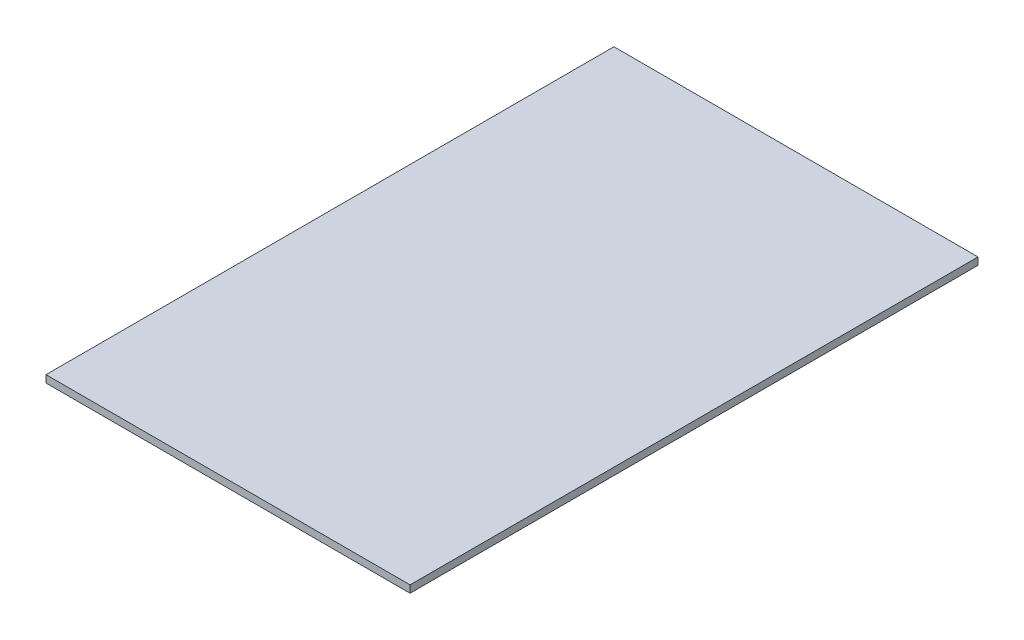
ISO-10303-21;
HEADER;
FILE_DESCRIPTION(('STEP AP214'),'2;1');
FILE_NAME('part.step','',(''),(''),'','','');
FILE_SCHEMA(('AUTOMOTIVE_DESIGN { 1 0 10303 214 1 1 1 1 }'));
ENDSEC;
DATA;
#1=APPLICATION_CONTEXT('core data for automotive mechanical design processes');
#2=APPLICATION_PROTOCOL_DEFINITION('international standard','automotive_design',2000,#1);
#3=PRODUCT_CONTEXT('',#1,'mechanical');
#4=PRODUCT('Part','Part','',(#3));
#5=PRODUCT_RELATED_PRODUCT_CATEGORY('part','',(#4));
#6=PRODUCT_DEFINITION_FORMATION('','',#4);
#7=PRODUCT_DEFINITION_CONTEXT('part definition',#1,'design');
#8=PRODUCT_DEFINITION('design','',#6,#7);
#9=PRODUCT_DEFINITION_SHAPE('','',#8);
#10=(LENGTH_UNIT() NAMED_UNIT(*) SI_UNIT(.MILLI.,.METRE.));
#11=(NAMED_UNIT(*) PLANE_ANGLE_UNIT() SI_UNIT($,.RADIAN.));
#12=(NAMED_UNIT(*) SI_UNIT($,.STERADIAN.) SOLID_ANGLE_UNIT());
#13=UNCERTAINTY_MEASURE_WITH_UNIT(LENGTH_MEASURE(1.E-05),#10,'distance_accuracy_value','');
#14=(GEOMETRIC_REPRESENTATION_CONTEXT(3) GLOBAL_UNCERTAINTY_ASSIGNED_CONTEXT((#13)) GLOBAL_UNIT_ASSIGNED_CONTEXT((#10,
#11,#12)) REPRESENTATION_CONTEXT('',''));
#15=CARTESIAN_POINT('',(0.,0.,0.));
#16=DIRECTION('',(0.,0.,1.));
#17=DIRECTION('',(1.,0.,0.));
#18=AXIS2_PLACEMENT_3D('',#15,#16,#17);
#19=CARTESIAN_POINT('',(158.75,6.35,247.65));
#20=DIRECTION('',(-1.,0.,0.));
#21=DIRECTION('',(0.,0.,1.));
#22=AXIS2_PLACEMENT_3D('',#19,#20,#21);
#23=PLANE('',#22);
#24=DIRECTION('',(0.,0.,-1.));
#25=VECTOR('',#24,1.);
#26=CARTESIAN_POINT('',(158.75,0.,247.65));
#27=LINE('',#26,#25);
#28=CARTESIAN_POINT('',(158.75,0.,247.65));
#29=VERTEX_POINT('',#28);
#30=CARTESIAN_POINT('',(158.75,0.,-247.65));
#31=VERTEX_POINT('',#30);
#32=EDGE_CURVE('E113',#29,#31,#27,.T.);
#33=ORIENTED_EDGE('',*,*,#32,.T.);
#34=DIRECTION('',(0.,-1.,0.));
#35=VECTOR('',#34,1.);
#36=CARTESIAN_POINT('',(158.75,6.35,-247.65));
#37=LINE('',#36,#35);
#38=CARTESIAN_POINT('',(158.75,6.35,-247.65));
#39=VERTEX_POINT('',#38);
#40=EDGE_CURVE('E11',#39,#31,#37,.T.);
#41=ORIENTED_EDGE('',*,*,#40,.F.);
#42=DIRECTION('',(0.,0.,-1.));
#43=VECTOR('',#42,1.);
#44=CARTESIAN_POINT('',(158.75,6.35,247.65));
#45=LINE('',#44,#43);
#46=CARTESIAN_POINT('',(158.75,6.35,247.65));
#47=VERTEX_POINT('',#46);
#48=EDGE_CURVE('E97',#47,#39,#45,.T.);
#49=ORIENTED_EDGE('',*,*,#48,.F.);
#50=DIRECTION('',(0.,-1.,0.));
#51=VECTOR('',#50,1.);
#52=CARTESIAN_POINT('',(158.75,6.35,247.65));
#53=LINE('',#52,#51);
#54=EDGE_CURVE('E109',#47,#29,#53,.T.);
#55=ORIENTED_EDGE('',*,*,#54,.T.);
#56=EDGE_LOOP('',(#33,#41,#49,#55));
#57=FACE_BOUND('',#56,.T.);
#58=ADVANCED_FACE('F45',(#57),#23,.F.);
#59=CARTESIAN_POINT('',(-158.75,6.35,-247.65));
#60=DIRECTION('',(0.,0.,1.));
#61=DIRECTION('',(1.,0.,0.));
#62=AXIS2_PLACEMENT_3D('',#59,#60,#61);
#63=PLANE('',#62);
#64=DIRECTION('',(-1.,0.,0.));
#65=VECTOR('',#64,1.);
#66=CARTESIAN_POINT('',(-158.75,0.,-247.65));
#67=LINE('',#66,#65);
#68=CARTESIAN_POINT('',(-158.75,0.,-247.65));
#69=VERTEX_POINT('',#68);
#70=EDGE_CURVE('E102',#31,#69,#67,.T.);
#71=ORIENTED_EDGE('',*,*,#70,.T.);
#72=DIRECTION('',(0.,-1.,0.));
#73=VECTOR('',#72,1.);
#74=CARTESIAN_POINT('',(-158.75,6.35,-247.65));
#75=LINE('',#74,#73);
#76=CARTESIAN_POINT('',(-158.75,6.35,-247.65));
#77=VERTEX_POINT('',#76);
#78=EDGE_CURVE('E54',#77,#69,#75,.T.);
#79=ORIENTED_EDGE('',*,*,#78,.F.);
#80=DIRECTION('',(-1.,0.,0.));
#81=VECTOR('',#80,1.);
#82=CARTESIAN_POINT('',(-158.75,6.35,-247.65));
#83=LINE('',#82,#81);
#84=EDGE_CURVE('E92',#39,#77,#83,.T.);
#85=ORIENTED_EDGE('',*,*,#84,.F.);
#86=ORIENTED_EDGE('',*,*,#40,.T.);
#87=EDGE_LOOP('',(#71,#79,#85,#86));
#88=FACE_BOUND('',#87,.T.);
#89=ADVANCED_FACE('F101',(#88),#63,.F.);
#90=CARTESIAN_POINT('',(-158.75,6.35,247.65));
#91=DIRECTION('',(1.,0.,0.));
#92=DIRECTION('',(0.,0.,-1.));
#93=AXIS2_PLACEMENT_3D('',#90,#91,#92);
#94=PLANE('',#93);
#95=DIRECTION('',(0.,0.,1.));
#96=VECTOR('',#95,1.);
#97=CARTESIAN_POINT('',(-158.75,0.,247.65));
#98=LINE('',#97,#96);
#99=CARTESIAN_POINT('',(-158.75,0.,247.65));
#100=VERTEX_POINT('',#99);
#101=EDGE_CURVE('E79',#69,#100,#98,.T.);
#102=ORIENTED_EDGE('',*,*,#101,.T.);
#103=DIRECTION('',(0.,-1.,0.));
#104=VECTOR('',#103,1.);
#105=CARTESIAN_POINT('',(-158.75,6.35,247.65));
#106=LINE('',#105,#104);
#107=CARTESIAN_POINT('',(-158.75,6.35,247.65));
#108=VERTEX_POINT('',#107);
#109=EDGE_CURVE('E104',#108,#100,#106,.T.);
#110=ORIENTED_EDGE('',*,*,#109,.F.);
#111=DIRECTION('',(0.,0.,1.));
#112=VECTOR('',#111,1.);
#113=CARTESIAN_POINT('',(-158.75,6.35,247.65));
#114=LINE('',#113,#112);
#115=EDGE_CURVE('E95',#77,#108,#114,.T.);
#116=ORIENTED_EDGE('',*,*,#115,.F.);
#117=ORIENTED_EDGE('',*,*,#78,.T.);
#118=EDGE_LOOP('',(#102,#110,#116,#117));
#119=FACE_BOUND('',#118,.T.);
#120=ADVANCED_FACE('F105',(#119),#94,.F.);
#121=CARTESIAN_POINT('',(-158.75,6.35,247.65));
#122=DIRECTION('',(0.,0.,-1.));
#123=DIRECTION('',(-1.,0.,0.));
#124=AXIS2_PLACEMENT_3D('',#121,#122,#123);
#125=PLANE('',#124);
#126=DIRECTION('',(1.,0.,0.));
#127=VECTOR('',#126,1.);
#128=CARTESIAN_POINT('',(-158.75,0.,247.65));
#129=LINE('',#128,#127);
#130=EDGE_CURVE('E85',#100,#29,#129,.T.);
#131=ORIENTED_EDGE('',*,*,#130,.T.);
#132=ORIENTED_EDGE('',*,*,#54,.F.);
#133=DIRECTION('',(1.,0.,0.));
#134=VECTOR('',#133,1.);
#135=CARTESIAN_POINT('',(-158.75,6.35,247.65));
#136=LINE('',#135,#134);
#137=EDGE_CURVE('E62',#108,#47,#136,.T.);
#138=ORIENTED_EDGE('',*,*,#137,.F.);
#139=ORIENTED_EDGE('',*,*,#109,.T.);
#140=EDGE_LOOP('',(#131,#132,#138,#139));
#141=FACE_BOUND('',#140,.T.);
#142=ADVANCED_FACE('F126',(#141),#125,.F.);
#143=CARTESIAN_POINT('',(0.,6.35,0.));
#144=DIRECTION('',(0.,-1.,0.));
#145=DIRECTION('',(0.,0.,-1.));
#146=AXIS2_PLACEMENT_3D('',#143,#144,#145);
#147=PLANE('',#146);
#148=ORIENTED_EDGE('',*,*,#48,.T.);
#149=ORIENTED_EDGE('',*,*,#84,.T.);
#150=ORIENTED_EDGE('',*,*,#115,.T.);
#151=ORIENTED_EDGE('',*,*,#137,.T.);
#152=EDGE_LOOP('',(#148,#149,#150,#151));
#153=FACE_BOUND('',#152,.T.);
#154=ADVANCED_FACE('F93',(#153),#147,.F.);
#155=CARTESIAN_POINT('',(0.,0.,0.));
#156=DIRECTION('',(0.,-1.,0.));
#157=DIRECTION('',(0.,0.,-1.));
#158=AXIS2_PLACEMENT_3D('',#155,#156,#157);
#159=PLANE('',#158);
#160=ORIENTED_EDGE('',*,*,#32,.F.);
#161=ORIENTED_EDGE('',*,*,#130,.F.);
#162=ORIENTED_EDGE('',*,*,#101,.F.);
#163=ORIENTED_EDGE('',*,*,#70,.F.);
#164=EDGE_LOOP('',(#160,#161,#162,#163));
#165=FACE_BOUND('',#164,.T.);
#166=ADVANCED_FACE('F129',(#165),#159,.T.);
#167=CLOSED_SHELL('',(#58,#89,#120,#142,#154,#166));
#168=MANIFOLD_SOLID_BREP('B2',#167);
#169=ADVANCED_BREP_SHAPE_REPRESENTATION('',(#18,#168),#14);
#170=SHAPE_DEFINITION_REPRESENTATION(#9,#169);
ENDSEC;
END-ISO-10303-21;
